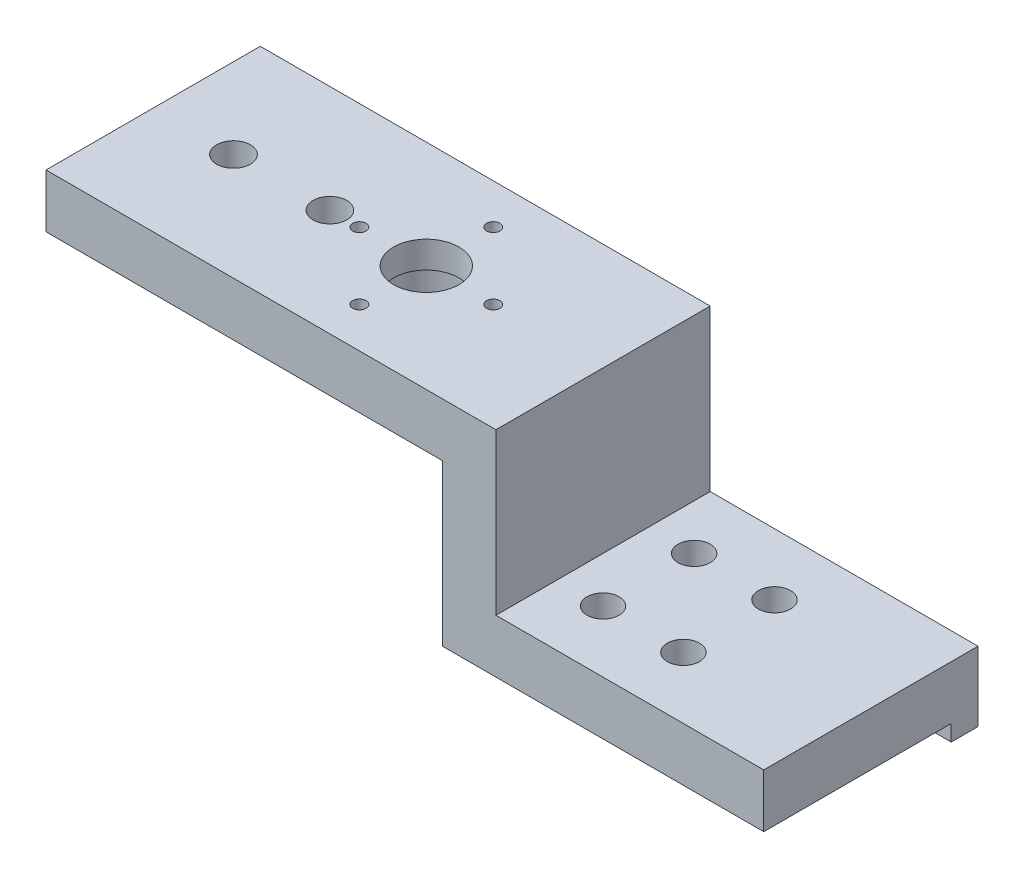
ISO-10303-21;
HEADER;
FILE_DESCRIPTION(('STEP AP214'),'2;1');
FILE_NAME('part.step','',(''),(''),'','','');
FILE_SCHEMA(('AUTOMOTIVE_DESIGN { 1 0 10303 214 1 1 1 1 }'));
ENDSEC;
DATA;
#1=APPLICATION_CONTEXT('core data for automotive mechanical design processes');
#2=APPLICATION_PROTOCOL_DEFINITION('international standard','automotive_design',2000,#1);
#3=PRODUCT_CONTEXT('',#1,'mechanical');
#4=PRODUCT('Part','Part','',(#3));
#5=PRODUCT_RELATED_PRODUCT_CATEGORY('part','',(#4));
#6=PRODUCT_DEFINITION_FORMATION('','',#4);
#7=PRODUCT_DEFINITION_CONTEXT('part definition',#1,'design');
#8=PRODUCT_DEFINITION('design','',#6,#7);
#9=PRODUCT_DEFINITION_SHAPE('','',#8);
#10=(LENGTH_UNIT() NAMED_UNIT(*) SI_UNIT(.MILLI.,.METRE.));
#11=(NAMED_UNIT(*) PLANE_ANGLE_UNIT() SI_UNIT($,.RADIAN.));
#12=(NAMED_UNIT(*) SI_UNIT($,.STERADIAN.) SOLID_ANGLE_UNIT());
#13=UNCERTAINTY_MEASURE_WITH_UNIT(LENGTH_MEASURE(1.E-05),#10,'distance_accuracy_value','');
#14=(GEOMETRIC_REPRESENTATION_CONTEXT(3) GLOBAL_UNCERTAINTY_ASSIGNED_CONTEXT((#13)) GLOBAL_UNIT_ASSIGNED_CONTEXT((#10,
#11,#12)) REPRESENTATION_CONTEXT('',''));
#15=CARTESIAN_POINT('',(0.,0.,0.));
#16=DIRECTION('',(0.,0.,1.));
#17=DIRECTION('',(1.,0.,0.));
#18=AXIS2_PLACEMENT_3D('',#15,#16,#17);
#19=CARTESIAN_POINT('',(-53.,104.,0.));
#20=DIRECTION('',(0.,-1.,0.));
#21=DIRECTION('',(0.,0.,-1.));
#22=AXIS2_PLACEMENT_3D('',#19,#20,#21);
#23=CYLINDRICAL_SURFACE('',#22,6.1);
#24=CARTESIAN_POINT('',(-53.,40.,0.));
#25=DIRECTION('',(0.,1.,0.));
#26=DIRECTION('',(0.,0.,1.));
#27=AXIS2_PLACEMENT_3D('',#24,#25,#26);
#28=CIRCLE('',#27,6.1);
#29=CARTESIAN_POINT('',(-53.,40.,6.1));
#30=VERTEX_POINT('',#29);
#31=EDGE_CURVE('E224',#30,#30,#28,.T.);
#32=ORIENTED_EDGE('',*,*,#31,.T.);
#33=EDGE_LOOP('',(#32));
#34=FACE_BOUND('',#33,.T.);
#35=CARTESIAN_POINT('',(-53.,35.,0.));
#36=DIRECTION('',(0.,-1.,0.));
#37=DIRECTION('',(0.,0.,-1.));
#38=AXIS2_PLACEMENT_3D('',#35,#36,#37);
#39=CIRCLE('',#38,6.1);
#40=CARTESIAN_POINT('',(-53.,35.,-6.1));
#41=VERTEX_POINT('',#40);
#42=EDGE_CURVE('E177',#41,#41,#39,.F.);
#43=ORIENTED_EDGE('',*,*,#42,.F.);
#44=EDGE_LOOP('',(#43));
#45=FACE_BOUND('',#44,.T.);
#46=ADVANCED_FACE('F42',(#34,#45),#23,.F.);
#47=CARTESIAN_POINT('',(-89.,104.,0.));
#48=DIRECTION('',(0.,-1.,0.));
#49=DIRECTION('',(0.,0.,-1.));
#50=AXIS2_PLACEMENT_3D('',#47,#48,#49);
#51=CYLINDRICAL_SURFACE('',#50,3.15);
#52=CARTESIAN_POINT('',(-89.,40.,0.));
#53=DIRECTION('',(0.,1.,0.));
#54=DIRECTION('',(0.,0.,1.));
#55=AXIS2_PLACEMENT_3D('',#52,#53,#54);
#56=CIRCLE('',#55,3.15);
#57=CARTESIAN_POINT('',(-89.,40.,3.15));
#58=VERTEX_POINT('',#57);
#59=EDGE_CURVE('E218',#58,#58,#56,.T.);
#60=ORIENTED_EDGE('',*,*,#59,.T.);
#61=EDGE_LOOP('',(#60));
#62=FACE_BOUND('',#61,.T.);
#63=CARTESIAN_POINT('',(-89.,33.,0.));
#64=DIRECTION('',(0.,-1.,0.));
#65=DIRECTION('',(0.,0.,-1.));
#66=AXIS2_PLACEMENT_3D('',#63,#64,#65);
#67=CIRCLE('',#66,3.15);
#68=CARTESIAN_POINT('',(-89.,33.,-3.15));
#69=VERTEX_POINT('',#68);
#70=EDGE_CURVE('E197',#69,#69,#67,.F.);
#71=ORIENTED_EDGE('',*,*,#70,.F.);
#72=EDGE_LOOP('',(#71));
#73=FACE_BOUND('',#72,.T.);
#74=ADVANCED_FACE('F282',(#62,#73),#51,.F.);
#75=CARTESIAN_POINT('',(-71.,104.,0.));
#76=DIRECTION('',(0.,-1.,0.));
#77=DIRECTION('',(0.,0.,-1.));
#78=AXIS2_PLACEMENT_3D('',#75,#76,#77);
#79=CYLINDRICAL_SURFACE('',#78,3.15);
#80=CARTESIAN_POINT('',(-71.,40.,0.));
#81=DIRECTION('',(0.,1.,0.));
#82=DIRECTION('',(0.,0.,1.));
#83=AXIS2_PLACEMENT_3D('',#80,#81,#82);
#84=CIRCLE('',#83,3.15);
#85=CARTESIAN_POINT('',(-71.,40.,3.15));
#86=VERTEX_POINT('',#85);
#87=EDGE_CURVE('E221',#86,#86,#84,.T.);
#88=ORIENTED_EDGE('',*,*,#87,.T.);
#89=EDGE_LOOP('',(#88));
#90=FACE_BOUND('',#89,.T.);
#91=CARTESIAN_POINT('',(-71.,33.,0.));
#92=DIRECTION('',(0.,-1.,0.));
#93=DIRECTION('',(0.,0.,-1.));
#94=AXIS2_PLACEMENT_3D('',#91,#92,#93);
#95=CIRCLE('',#94,3.15);
#96=CARTESIAN_POINT('',(-71.,33.,-3.15));
#97=VERTEX_POINT('',#96);
#98=EDGE_CURVE('E183',#97,#97,#95,.F.);
#99=ORIENTED_EDGE('',*,*,#98,.F.);
#100=EDGE_LOOP('',(#99));
#101=FACE_BOUND('',#100,.T.);
#102=ADVANCED_FACE('F288',(#90,#101),#79,.F.);
#103=CARTESIAN_POINT('',(0.,10.,0.));
#104=DIRECTION('',(0.,-1.,0.));
#105=DIRECTION('',(0.,0.,-1.));
#106=AXIS2_PLACEMENT_3D('',#103,#104,#105);
#107=PLANE('',#106);
#108=CARTESIAN_POINT('',(-11.5,9.99999999999999,-8.5));
#109=DIRECTION('',(0.,-1.,0.));
#110=DIRECTION('',(0.,0.,-1.));
#111=AXIS2_PLACEMENT_3D('',#108,#109,#110);
#112=CIRCLE('',#111,3.);
#113=CARTESIAN_POINT('',(-11.5,9.99999999999999,-11.5));
#114=VERTEX_POINT('',#113);
#115=EDGE_CURVE('E215',#114,#114,#112,.T.);
#116=ORIENTED_EDGE('',*,*,#115,.T.);
#117=EDGE_LOOP('',(#116));
#118=FACE_BOUND('',#117,.T.);
#119=CARTESIAN_POINT('',(3.50000000000002,9.99999999999999,8.5));
#120=DIRECTION('',(0.,-1.,0.));
#121=DIRECTION('',(0.,0.,-1.));
#122=AXIS2_PLACEMENT_3D('',#119,#120,#121);
#123=CIRCLE('',#122,3.);
#124=CARTESIAN_POINT('',(3.50000000000002,9.99999999999999,5.5));
#125=VERTEX_POINT('',#124);
#126=EDGE_CURVE('E212',#125,#125,#123,.T.);
#127=ORIENTED_EDGE('',*,*,#126,.T.);
#128=EDGE_LOOP('',(#127));
#129=FACE_BOUND('',#128,.T.);
#130=CARTESIAN_POINT('',(3.50000000000002,9.99999999999999,-8.5));
#131=DIRECTION('',(0.,-1.,0.));
#132=DIRECTION('',(0.,0.,-1.));
#133=AXIS2_PLACEMENT_3D('',#130,#131,#132);
#134=CIRCLE('',#133,3.);
#135=CARTESIAN_POINT('',(3.50000000000002,9.99999999999999,-11.5));
#136=VERTEX_POINT('',#135);
#137=EDGE_CURVE('E209',#136,#136,#134,.T.);
#138=ORIENTED_EDGE('',*,*,#137,.T.);
#139=EDGE_LOOP('',(#138));
#140=FACE_BOUND('',#139,.T.);
#141=CARTESIAN_POINT('',(-11.5,9.99999999999999,8.5));
#142=DIRECTION('',(0.,-1.,0.));
#143=DIRECTION('',(0.,0.,-1.));
#144=AXIS2_PLACEMENT_3D('',#141,#142,#143);
#145=CIRCLE('',#144,3.);
#146=CARTESIAN_POINT('',(-11.5,9.99999999999999,5.5));
#147=VERTEX_POINT('',#146);
#148=EDGE_CURVE('E206',#147,#147,#145,.T.);
#149=ORIENTED_EDGE('',*,*,#148,.T.);
#150=EDGE_LOOP('',(#149));
#151=FACE_BOUND('',#150,.T.);
#152=DIRECTION('',(0.,0.,-1.));
#153=VECTOR('',#152,1.);
#154=CARTESIAN_POINT('',(-20.,10.,20.));
#155=LINE('',#154,#153);
#156=CARTESIAN_POINT('',(-20.,10.,20.));
#157=VERTEX_POINT('',#156);
#158=CARTESIAN_POINT('',(-20.,10.,-20.));
#159=VERTEX_POINT('',#158);
#160=EDGE_CURVE('E243',#157,#159,#155,.T.);
#161=ORIENTED_EDGE('',*,*,#160,.F.);
#162=DIRECTION('',(1.,0.,0.));
#163=VECTOR('',#162,1.);
#164=CARTESIAN_POINT('',(-30.,10.,20.));
#165=LINE('',#164,#163);
#166=CARTESIAN_POINT('',(30.,10.,20.));
#167=VERTEX_POINT('',#166);
#168=EDGE_CURVE('E128',#157,#167,#165,.T.);
#169=ORIENTED_EDGE('',*,*,#168,.T.);
#170=DIRECTION('',(0.,0.,-1.));
#171=VECTOR('',#170,1.);
#172=CARTESIAN_POINT('',(30.,10.,20.));
#173=LINE('',#172,#171);
#174=CARTESIAN_POINT('',(30.,10.,-20.));
#175=VERTEX_POINT('',#174);
#176=EDGE_CURVE('E261',#167,#175,#173,.T.);
#177=ORIENTED_EDGE('',*,*,#176,.T.);
#178=DIRECTION('',(1.,0.,0.));
#179=VECTOR('',#178,1.);
#180=CARTESIAN_POINT('',(-30.,10.,-20.));
#181=LINE('',#180,#179);
#182=EDGE_CURVE('E259',#159,#175,#181,.T.);
#183=ORIENTED_EDGE('',*,*,#182,.F.);
#184=EDGE_LOOP('',(#161,#169,#177,#183));
#185=FACE_BOUND('',#184,.T.);
#186=ADVANCED_FACE('F296',(#118,#129,#140,#151,#185),#107,.F.);
#187=CARTESIAN_POINT('',(-30.,10.,20.));
#188=DIRECTION('',(-1.,0.,0.));
#189=DIRECTION('',(0.,0.,1.));
#190=AXIS2_PLACEMENT_3D('',#187,#188,#189);
#191=PLANE('',#190);
#192=DIRECTION('',(0.,0.,1.));
#193=VECTOR('',#192,1.);
#194=CARTESIAN_POINT('',(-30.,30.,-20.));
#195=LINE('',#194,#193);
#196=CARTESIAN_POINT('',(-30.,30.,-20.));
#197=VERTEX_POINT('',#196);
#198=CARTESIAN_POINT('',(-30.,30.,20.));
#199=VERTEX_POINT('',#198);
#200=EDGE_CURVE('E67',#197,#199,#195,.T.);
#201=ORIENTED_EDGE('',*,*,#200,.F.);
#202=DIRECTION('',(0.,-1.,0.));
#203=VECTOR('',#202,1.);
#204=CARTESIAN_POINT('',(-30.,10.,-20.));
#205=LINE('',#204,#203);
#206=CARTESIAN_POINT('',(-30.,-3.,-20.));
#207=VERTEX_POINT('',#206);
#208=EDGE_CURVE('E119',#197,#207,#205,.T.);
#209=ORIENTED_EDGE('',*,*,#208,.T.);
#210=DIRECTION('',(0.,0.,-1.));
#211=VECTOR('',#210,1.);
#212=CARTESIAN_POINT('',(-30.,-3.,-20.));
#213=LINE('',#212,#211);
#214=CARTESIAN_POINT('',(-30.,-3.,-15.));
#215=VERTEX_POINT('',#214);
#216=EDGE_CURVE('E123',#215,#207,#213,.T.);
#217=ORIENTED_EDGE('',*,*,#216,.F.);
#218=DIRECTION('',(0.,1.,0.));
#219=VECTOR('',#218,1.);
#220=CARTESIAN_POINT('',(-30.,-3.,-15.));
#221=LINE('',#220,#219);
#222=CARTESIAN_POINT('',(-30.,0.,-15.));
#223=VERTEX_POINT('',#222);
#224=EDGE_CURVE('E146',#215,#223,#221,.T.);
#225=ORIENTED_EDGE('',*,*,#224,.T.);
#226=DIRECTION('',(0.,0.,-1.));
#227=VECTOR('',#226,1.);
#228=CARTESIAN_POINT('',(-30.,0.,20.));
#229=LINE('',#228,#227);
#230=CARTESIAN_POINT('',(-30.,0.,20.));
#231=VERTEX_POINT('',#230);
#232=EDGE_CURVE('E258',#231,#223,#229,.T.);
#233=ORIENTED_EDGE('',*,*,#232,.F.);
#234=DIRECTION('',(0.,-1.,0.));
#235=VECTOR('',#234,1.);
#236=CARTESIAN_POINT('',(-30.,10.,20.));
#237=LINE('',#236,#235);
#238=EDGE_CURVE('E11',#199,#231,#237,.T.);
#239=ORIENTED_EDGE('',*,*,#238,.F.);
#240=EDGE_LOOP('',(#201,#209,#217,#225,#233,#239));
#241=FACE_BOUND('',#240,.T.);
#242=ADVANCED_FACE('F44',(#241),#191,.T.);
#243=CARTESIAN_POINT('',(-30.,10.,20.));
#244=DIRECTION('',(0.,0.,-1.));
#245=DIRECTION('',(-1.,0.,0.));
#246=AXIS2_PLACEMENT_3D('',#243,#244,#245);
#247=PLANE('',#246);
#248=DIRECTION('',(1.,0.,0.));
#249=VECTOR('',#248,1.);
#250=CARTESIAN_POINT('',(-30.,0.,20.));
#251=LINE('',#250,#249);
#252=CARTESIAN_POINT('',(30.,0.,20.));
#253=VERTEX_POINT('',#252);
#254=EDGE_CURVE('E262',#231,#253,#251,.T.);
#255=ORIENTED_EDGE('',*,*,#254,.T.);
#256=DIRECTION('',(0.,-1.,0.));
#257=VECTOR('',#256,1.);
#258=CARTESIAN_POINT('',(30.,10.,20.));
#259=LINE('',#258,#257);
#260=EDGE_CURVE('E51',#167,#253,#259,.T.);
#261=ORIENTED_EDGE('',*,*,#260,.F.);
#262=ORIENTED_EDGE('',*,*,#168,.F.);
#263=DIRECTION('',(0.,-1.,0.));
#264=VECTOR('',#263,1.);
#265=CARTESIAN_POINT('',(-20.,40.,20.));
#266=LINE('',#265,#264);
#267=CARTESIAN_POINT('',(-20.,40.,20.));
#268=VERTEX_POINT('',#267);
#269=EDGE_CURVE('E255',#268,#157,#266,.T.);
#270=ORIENTED_EDGE('',*,*,#269,.F.);
#271=DIRECTION('',(1.,0.,0.));
#272=VECTOR('',#271,1.);
#273=CARTESIAN_POINT('',(-20.,40.,20.));
#274=LINE('',#273,#272);
#275=CARTESIAN_POINT('',(-104.,40.,20.));
#276=VERTEX_POINT('',#275);
#277=EDGE_CURVE('E244',#276,#268,#274,.T.);
#278=ORIENTED_EDGE('',*,*,#277,.F.);
#279=DIRECTION('',(0.,1.,0.));
#280=VECTOR('',#279,1.);
#281=CARTESIAN_POINT('',(-104.,30.,20.));
#282=LINE('',#281,#280);
#283=CARTESIAN_POINT('',(-104.,30.,20.));
#284=VERTEX_POINT('',#283);
#285=EDGE_CURVE('E227',#284,#276,#282,.T.);
#286=ORIENTED_EDGE('',*,*,#285,.F.);
#287=DIRECTION('',(1.,0.,0.));
#288=VECTOR('',#287,1.);
#289=CARTESIAN_POINT('',(-104.,30.,20.));
#290=LINE('',#289,#288);
#291=EDGE_CURVE('E237',#284,#199,#290,.T.);
#292=ORIENTED_EDGE('',*,*,#291,.T.);
#293=ORIENTED_EDGE('',*,*,#238,.T.);
#294=EDGE_LOOP('',(#255,#261,#262,#270,#278,#286,#292,#293));
#295=FACE_BOUND('',#294,.T.);
#296=ADVANCED_FACE('F321',(#295),#247,.F.);
#297=CARTESIAN_POINT('',(30.,10.,20.));
#298=DIRECTION('',(-1.,0.,0.));
#299=DIRECTION('',(0.,0.,1.));
#300=AXIS2_PLACEMENT_3D('',#297,#298,#299);
#301=PLANE('',#300);
#302=DIRECTION('',(0.,0.,-1.));
#303=VECTOR('',#302,1.);
#304=CARTESIAN_POINT('',(30.,0.,20.));
#305=LINE('',#304,#303);
#306=CARTESIAN_POINT('',(30.,0.,-15.));
#307=VERTEX_POINT('',#306);
#308=EDGE_CURVE('E267',#253,#307,#305,.T.);
#309=ORIENTED_EDGE('',*,*,#308,.T.);
#310=DIRECTION('',(0.,1.,0.));
#311=VECTOR('',#310,1.);
#312=CARTESIAN_POINT('',(30.,-3.,-15.));
#313=LINE('',#312,#311);
#314=CARTESIAN_POINT('',(30.,-3.,-15.));
#315=VERTEX_POINT('',#314);
#316=EDGE_CURVE('E149',#315,#307,#313,.T.);
#317=ORIENTED_EDGE('',*,*,#316,.F.);
#318=DIRECTION('',(0.,0.,1.));
#319=VECTOR('',#318,1.);
#320=CARTESIAN_POINT('',(30.,-3.,-20.));
#321=LINE('',#320,#319);
#322=CARTESIAN_POINT('',(30.,-3.,-20.));
#323=VERTEX_POINT('',#322);
#324=EDGE_CURVE('E136',#323,#315,#321,.T.);
#325=ORIENTED_EDGE('',*,*,#324,.F.);
#326=DIRECTION('',(0.,-1.,0.));
#327=VECTOR('',#326,1.);
#328=CARTESIAN_POINT('',(30.,10.,-20.));
#329=LINE('',#328,#327);
#330=EDGE_CURVE('E127',#175,#323,#329,.T.);
#331=ORIENTED_EDGE('',*,*,#330,.F.);
#332=ORIENTED_EDGE('',*,*,#176,.F.);
#333=ORIENTED_EDGE('',*,*,#260,.T.);
#334=EDGE_LOOP('',(#309,#317,#325,#331,#332,#333));
#335=FACE_BOUND('',#334,.T.);
#336=ADVANCED_FACE('F324',(#335),#301,.F.);
#337=CARTESIAN_POINT('',(-30.,10.,-20.));
#338=DIRECTION('',(0.,0.,-1.));
#339=DIRECTION('',(-1.,0.,0.));
#340=AXIS2_PLACEMENT_3D('',#337,#338,#339);
#341=PLANE('',#340);
#342=ORIENTED_EDGE('',*,*,#330,.T.);
#343=DIRECTION('',(1.,0.,0.));
#344=VECTOR('',#343,1.);
#345=CARTESIAN_POINT('',(-30.,-3.,-20.));
#346=LINE('',#345,#344);
#347=EDGE_CURVE('E131',#207,#323,#346,.T.);
#348=ORIENTED_EDGE('',*,*,#347,.F.);
#349=ORIENTED_EDGE('',*,*,#208,.F.);
#350=DIRECTION('',(1.,0.,0.));
#351=VECTOR('',#350,1.);
#352=CARTESIAN_POINT('',(-104.,30.,-20.));
#353=LINE('',#352,#351);
#354=CARTESIAN_POINT('',(-104.,30.,-20.));
#355=VERTEX_POINT('',#354);
#356=EDGE_CURVE('E241',#355,#197,#353,.T.);
#357=ORIENTED_EDGE('',*,*,#356,.F.);
#358=DIRECTION('',(0.,-1.,0.));
#359=VECTOR('',#358,1.);
#360=CARTESIAN_POINT('',(-104.,30.,-20.));
#361=LINE('',#360,#359);
#362=CARTESIAN_POINT('',(-104.,40.,-20.));
#363=VERTEX_POINT('',#362);
#364=EDGE_CURVE('E233',#363,#355,#361,.T.);
#365=ORIENTED_EDGE('',*,*,#364,.F.);
#366=DIRECTION('',(-1.,0.,0.));
#367=VECTOR('',#366,1.);
#368=CARTESIAN_POINT('',(-20.,40.,-20.));
#369=LINE('',#368,#367);
#370=CARTESIAN_POINT('',(-20.,40.,-20.));
#371=VERTEX_POINT('',#370);
#372=EDGE_CURVE('E248',#371,#363,#369,.T.);
#373=ORIENTED_EDGE('',*,*,#372,.F.);
#374=DIRECTION('',(0.,-1.,0.));
#375=VECTOR('',#374,1.);
#376=CARTESIAN_POINT('',(-20.,40.,-20.));
#377=LINE('',#376,#375);
#378=EDGE_CURVE('E250',#371,#159,#377,.T.);
#379=ORIENTED_EDGE('',*,*,#378,.T.);
#380=ORIENTED_EDGE('',*,*,#182,.T.);
#381=EDGE_LOOP('',(#342,#348,#349,#357,#365,#373,#379,#380));
#382=FACE_BOUND('',#381,.T.);
#383=ADVANCED_FACE('F132',(#382),#341,.T.);
#384=CARTESIAN_POINT('',(0.,0.,0.));
#385=DIRECTION('',(0.,-1.,0.));
#386=DIRECTION('',(0.,0.,-1.));
#387=AXIS2_PLACEMENT_3D('',#384,#385,#386);
#388=PLANE('',#387);
#389=DIRECTION('',(-1.,0.,0.));
#390=VECTOR('',#389,1.);
#391=CARTESIAN_POINT('',(-30.,0.,-15.));
#392=LINE('',#391,#390);
#393=EDGE_CURVE('E59',#307,#223,#392,.T.);
#394=ORIENTED_EDGE('',*,*,#393,.F.);
#395=ORIENTED_EDGE('',*,*,#308,.F.);
#396=ORIENTED_EDGE('',*,*,#254,.F.);
#397=ORIENTED_EDGE('',*,*,#232,.T.);
#398=EDGE_LOOP('',(#394,#395,#396,#397));
#399=FACE_BOUND('',#398,.T.);
#400=CARTESIAN_POINT('',(-11.5,0.,-8.5));
#401=DIRECTION('',(0.,-1.,0.));
#402=DIRECTION('',(0.,0.,1.));
#403=AXIS2_PLACEMENT_3D('',#400,#401,#402);
#404=CIRCLE('',#403,3.);
#405=CARTESIAN_POINT('',(-11.5,0.,-5.5));
#406=VERTEX_POINT('',#405);
#407=EDGE_CURVE('E198',#406,#406,#404,.T.);
#408=ORIENTED_EDGE('',*,*,#407,.F.);
#409=EDGE_LOOP('',(#408));
#410=FACE_BOUND('',#409,.T.);
#411=CARTESIAN_POINT('',(3.50000000000002,0.,8.5));
#412=DIRECTION('',(0.,-1.,0.));
#413=DIRECTION('',(0.,0.,-1.));
#414=AXIS2_PLACEMENT_3D('',#411,#412,#413);
#415=CIRCLE('',#414,3.);
#416=CARTESIAN_POINT('',(3.50000000000002,0.,5.5));
#417=VERTEX_POINT('',#416);
#418=EDGE_CURVE('E196',#417,#417,#415,.T.);
#419=ORIENTED_EDGE('',*,*,#418,.F.);
#420=EDGE_LOOP('',(#419));
#421=FACE_BOUND('',#420,.T.);
#422=CARTESIAN_POINT('',(3.50000000000002,0.,-8.5));
#423=DIRECTION('',(0.,-1.,0.));
#424=DIRECTION('',(0.,0.,-1.));
#425=AXIS2_PLACEMENT_3D('',#422,#423,#424);
#426=CIRCLE('',#425,3.);
#427=CARTESIAN_POINT('',(3.50000000000002,0.,-11.5));
#428=VERTEX_POINT('',#427);
#429=EDGE_CURVE('E193',#428,#428,#426,.T.);
#430=ORIENTED_EDGE('',*,*,#429,.F.);
#431=EDGE_LOOP('',(#430));
#432=FACE_BOUND('',#431,.T.);
#433=CARTESIAN_POINT('',(-11.5,0.,8.5));
#434=DIRECTION('',(0.,-1.,0.));
#435=DIRECTION('',(0.,0.,-1.));
#436=AXIS2_PLACEMENT_3D('',#433,#434,#435);
#437=CIRCLE('',#436,3.);
#438=CARTESIAN_POINT('',(-11.5,0.,5.5));
#439=VERTEX_POINT('',#438);
#440=EDGE_CURVE('E201',#439,#439,#437,.T.);
#441=ORIENTED_EDGE('',*,*,#440,.F.);
#442=EDGE_LOOP('',(#441));
#443=FACE_BOUND('',#442,.T.);
#444=ADVANCED_FACE('F314',(#399,#410,#421,#432,#443),#388,.T.);
#445=CARTESIAN_POINT('',(-20.,40.,20.));
#446=DIRECTION('',(-1.,0.,0.));
#447=DIRECTION('',(0.,0.,1.));
#448=AXIS2_PLACEMENT_3D('',#445,#446,#447);
#449=PLANE('',#448);
#450=ORIENTED_EDGE('',*,*,#160,.T.);
#451=ORIENTED_EDGE('',*,*,#378,.F.);
#452=DIRECTION('',(0.,0.,-1.));
#453=VECTOR('',#452,1.);
#454=CARTESIAN_POINT('',(-20.,40.,20.));
#455=LINE('',#454,#453);
#456=EDGE_CURVE('E246',#268,#371,#455,.T.);
#457=ORIENTED_EDGE('',*,*,#456,.F.);
#458=ORIENTED_EDGE('',*,*,#269,.T.);
#459=EDGE_LOOP('',(#450,#451,#457,#458));
#460=FACE_BOUND('',#459,.T.);
#461=ADVANCED_FACE('F310',(#460),#449,.F.);
#462=CARTESIAN_POINT('',(0.,40.,0.));
#463=DIRECTION('',(0.,1.,0.));
#464=DIRECTION('',(0.,0.,1.));
#465=AXIS2_PLACEMENT_3D('',#462,#463,#464);
#466=PLANE('',#465);
#467=CARTESIAN_POINT('',(-40.5,40.,-1.31838984174237E-13));
#468=DIRECTION('',(0.,1.,0.));
#469=DIRECTION('',(0.,0.,1.));
#470=AXIS2_PLACEMENT_3D('',#467,#468,#469);
#471=CIRCLE('',#470,1.24999999999999);
#472=CARTESIAN_POINT('',(-40.5,40.,1.24999999999986));
#473=VERTEX_POINT('',#472);
#474=EDGE_CURVE('E152',#473,#473,#471,.T.);
#475=ORIENTED_EDGE('',*,*,#474,.F.);
#476=EDGE_LOOP('',(#475));
#477=FACE_BOUND('',#476,.T.);
#478=CARTESIAN_POINT('',(-53.,40.,12.5));
#479=DIRECTION('',(0.,1.,0.));
#480=DIRECTION('',(0.,0.,1.));
#481=AXIS2_PLACEMENT_3D('',#478,#479,#480);
#482=CIRCLE('',#481,1.24999999999999);
#483=CARTESIAN_POINT('',(-53.,40.,13.75));
#484=VERTEX_POINT('',#483);
#485=EDGE_CURVE('E158',#484,#484,#482,.T.);
#486=ORIENTED_EDGE('',*,*,#485,.F.);
#487=EDGE_LOOP('',(#486));
#488=FACE_BOUND('',#487,.T.);
#489=CARTESIAN_POINT('',(-65.5,40.,0.));
#490=DIRECTION('',(0.,1.,0.));
#491=DIRECTION('',(0.,0.,1.));
#492=AXIS2_PLACEMENT_3D('',#489,#490,#491);
#493=CIRCLE('',#492,1.25);
#494=CARTESIAN_POINT('',(-65.5,40.,1.25000000000004));
#495=VERTEX_POINT('',#494);
#496=EDGE_CURVE('E164',#495,#495,#493,.T.);
#497=ORIENTED_EDGE('',*,*,#496,.F.);
#498=EDGE_LOOP('',(#497));
#499=FACE_BOUND('',#498,.T.);
#500=CARTESIAN_POINT('',(-53.,40.,-12.5));
#501=DIRECTION('',(0.,1.,0.));
#502=DIRECTION('',(0.,0.,1.));
#503=AXIS2_PLACEMENT_3D('',#500,#501,#502);
#504=CIRCLE('',#503,1.24999999999999);
#505=CARTESIAN_POINT('',(-53.,40.,-11.25));
#506=VERTEX_POINT('',#505);
#507=EDGE_CURVE('E167',#506,#506,#504,.T.);
#508=ORIENTED_EDGE('',*,*,#507,.F.);
#509=EDGE_LOOP('',(#508));
#510=FACE_BOUND('',#509,.T.);
#511=ORIENTED_EDGE('',*,*,#31,.F.);
#512=EDGE_LOOP('',(#511));
#513=FACE_BOUND('',#512,.T.);
#514=ORIENTED_EDGE('',*,*,#87,.F.);
#515=EDGE_LOOP('',(#514));
#516=FACE_BOUND('',#515,.T.);
#517=ORIENTED_EDGE('',*,*,#59,.F.);
#518=EDGE_LOOP('',(#517));
#519=FACE_BOUND('',#518,.T.);
#520=ORIENTED_EDGE('',*,*,#372,.T.);
#521=DIRECTION('',(0.,0.,-1.));
#522=VECTOR('',#521,1.);
#523=CARTESIAN_POINT('',(-104.,40.,-20.));
#524=LINE('',#523,#522);
#525=EDGE_CURVE('E230',#276,#363,#524,.T.);
#526=ORIENTED_EDGE('',*,*,#525,.F.);
#527=ORIENTED_EDGE('',*,*,#277,.T.);
#528=ORIENTED_EDGE('',*,*,#456,.T.);
#529=EDGE_LOOP('',(#520,#526,#527,#528));
#530=FACE_BOUND('',#529,.T.);
#531=ADVANCED_FACE('F306',(#477,#488,#499,#510,#513,#516,#519,#530),#466,.T.);
#532=CARTESIAN_POINT('',(-104.,30.,-20.));
#533=DIRECTION('',(0.,1.,0.));
#534=DIRECTION('',(0.,0.,1.));
#535=AXIS2_PLACEMENT_3D('',#532,#533,#534);
#536=PLANE('',#535);
#537=CARTESIAN_POINT('',(-40.5,30.,-1.31838984174237E-13));
#538=DIRECTION('',(0.,1.,0.));
#539=DIRECTION('',(0.,0.,1.));
#540=AXIS2_PLACEMENT_3D('',#537,#538,#539);
#541=CIRCLE('',#540,1.24999999999999);
#542=CARTESIAN_POINT('',(-40.5,30.,1.24999999999986));
#543=VERTEX_POINT('',#542);
#544=EDGE_CURVE('E155',#543,#543,#541,.T.);
#545=ORIENTED_EDGE('',*,*,#544,.T.);
#546=EDGE_LOOP('',(#545));
#547=FACE_BOUND('',#546,.T.);
#548=CARTESIAN_POINT('',(-53.,30.,12.5));
#549=DIRECTION('',(0.,1.,0.));
#550=DIRECTION('',(0.,0.,1.));
#551=AXIS2_PLACEMENT_3D('',#548,#549,#550);
#552=CIRCLE('',#551,1.24999999999999);
#553=CARTESIAN_POINT('',(-53.,30.,13.75));
#554=VERTEX_POINT('',#553);
#555=EDGE_CURVE('E161',#554,#554,#552,.T.);
#556=ORIENTED_EDGE('',*,*,#555,.T.);
#557=EDGE_LOOP('',(#556));
#558=FACE_BOUND('',#557,.T.);
#559=CARTESIAN_POINT('',(-65.5,30.,0.));
#560=DIRECTION('',(0.,1.,0.));
#561=DIRECTION('',(0.,0.,1.));
#562=AXIS2_PLACEMENT_3D('',#559,#560,#561);
#563=CIRCLE('',#562,1.24999999999999);
#564=CARTESIAN_POINT('',(-65.5,30.,1.25000000000004));
#565=VERTEX_POINT('',#564);
#566=EDGE_CURVE('E46',#565,#565,#563,.T.);
#567=ORIENTED_EDGE('',*,*,#566,.T.);
#568=EDGE_LOOP('',(#567));
#569=FACE_BOUND('',#568,.T.);
#570=CARTESIAN_POINT('',(-53.,30.,-12.5));
#571=DIRECTION('',(0.,1.,0.));
#572=DIRECTION('',(0.,0.,1.));
#573=AXIS2_PLACEMENT_3D('',#570,#571,#572);
#574=CIRCLE('',#573,1.24999999999999);
#575=CARTESIAN_POINT('',(-53.,30.,-11.25));
#576=VERTEX_POINT('',#575);
#577=EDGE_CURVE('E170',#576,#576,#574,.T.);
#578=ORIENTED_EDGE('',*,*,#577,.T.);
#579=EDGE_LOOP('',(#578));
#580=FACE_BOUND('',#579,.T.);
#581=CARTESIAN_POINT('',(-53.,30.,0.));
#582=DIRECTION('',(0.,-1.,0.));
#583=DIRECTION('',(0.,0.,-1.));
#584=AXIS2_PLACEMENT_3D('',#581,#582,#583);
#585=CIRCLE('',#584,6.5);
#586=CARTESIAN_POINT('',(-53.,30.,-6.5));
#587=VERTEX_POINT('',#586);
#588=EDGE_CURVE('E173',#587,#587,#585,.T.);
#589=ORIENTED_EDGE('',*,*,#588,.F.);
#590=EDGE_LOOP('',(#589));
#591=FACE_BOUND('',#590,.T.);
#592=CARTESIAN_POINT('',(-89.,30.,0.));
#593=DIRECTION('',(0.,-1.,0.));
#594=DIRECTION('',(0.,0.,-1.));
#595=AXIS2_PLACEMENT_3D('',#592,#593,#594);
#596=CIRCLE('',#595,3.50000000000001);
#597=CARTESIAN_POINT('',(-89.,30.,-3.50000000000001));
#598=VERTEX_POINT('',#597);
#599=EDGE_CURVE('E184',#598,#598,#596,.T.);
#600=ORIENTED_EDGE('',*,*,#599,.F.);
#601=EDGE_LOOP('',(#600));
#602=FACE_BOUND('',#601,.T.);
#603=CARTESIAN_POINT('',(-71.,30.,0.));
#604=DIRECTION('',(0.,-1.,0.));
#605=DIRECTION('',(0.,0.,-1.));
#606=AXIS2_PLACEMENT_3D('',#603,#604,#605);
#607=CIRCLE('',#606,3.50000000000001);
#608=CARTESIAN_POINT('',(-71.,30.,-3.50000000000001));
#609=VERTEX_POINT('',#608);
#610=EDGE_CURVE('E190',#609,#609,#607,.T.);
#611=ORIENTED_EDGE('',*,*,#610,.F.);
#612=EDGE_LOOP('',(#611));
#613=FACE_BOUND('',#612,.T.);
#614=ORIENTED_EDGE('',*,*,#200,.T.);
#615=ORIENTED_EDGE('',*,*,#291,.F.);
#616=DIRECTION('',(0.,0.,1.));
#617=VECTOR('',#616,1.);
#618=CARTESIAN_POINT('',(-104.,30.,-20.));
#619=LINE('',#618,#617);
#620=EDGE_CURVE('E235',#355,#284,#619,.T.);
#621=ORIENTED_EDGE('',*,*,#620,.F.);
#622=ORIENTED_EDGE('',*,*,#356,.T.);
#623=EDGE_LOOP('',(#614,#615,#621,#622));
#624=FACE_BOUND('',#623,.T.);
#625=ADVANCED_FACE('F302',(#547,#558,#569,#580,#591,#602,#613,#624),#536,.F.);
#626=CARTESIAN_POINT('',(-104.,0.,0.));
#627=DIRECTION('',(1.,0.,0.));
#628=DIRECTION('',(0.,0.,-1.));
#629=AXIS2_PLACEMENT_3D('',#626,#627,#628);
#630=PLANE('',#629);
#631=ORIENTED_EDGE('',*,*,#285,.T.);
#632=ORIENTED_EDGE('',*,*,#525,.T.);
#633=ORIENTED_EDGE('',*,*,#364,.T.);
#634=ORIENTED_EDGE('',*,*,#620,.T.);
#635=EDGE_LOOP('',(#631,#632,#633,#634));
#636=FACE_BOUND('',#635,.T.);
#637=ADVANCED_FACE('F299',(#636),#630,.F.);
#638=CARTESIAN_POINT('',(-11.5,74.,8.5));
#639=DIRECTION('',(0.,-1.,0.));
#640=DIRECTION('',(0.,0.,-1.));
#641=AXIS2_PLACEMENT_3D('',#638,#639,#640);
#642=CYLINDRICAL_SURFACE('',#641,3.);
#643=ORIENTED_EDGE('',*,*,#440,.T.);
#644=EDGE_LOOP('',(#643));
#645=FACE_BOUND('',#644,.T.);
#646=ORIENTED_EDGE('',*,*,#148,.F.);
#647=EDGE_LOOP('',(#646));
#648=FACE_BOUND('',#647,.T.);
#649=ADVANCED_FACE('F293',(#645,#648),#642,.F.);
#650=CARTESIAN_POINT('',(3.50000000000002,74.,-8.5));
#651=DIRECTION('',(0.,-1.,0.));
#652=DIRECTION('',(0.,0.,-1.));
#653=AXIS2_PLACEMENT_3D('',#650,#651,#652);
#654=CYLINDRICAL_SURFACE('',#653,3.);
#655=ORIENTED_EDGE('',*,*,#429,.T.);
#656=EDGE_LOOP('',(#655));
#657=FACE_BOUND('',#656,.T.);
#658=ORIENTED_EDGE('',*,*,#137,.F.);
#659=EDGE_LOOP('',(#658));
#660=FACE_BOUND('',#659,.T.);
#661=ADVANCED_FACE('F364',(#657,#660),#654,.F.);
#662=CARTESIAN_POINT('',(3.50000000000002,74.,8.5));
#663=DIRECTION('',(0.,-1.,0.));
#664=DIRECTION('',(0.,0.,-1.));
#665=AXIS2_PLACEMENT_3D('',#662,#663,#664);
#666=CYLINDRICAL_SURFACE('',#665,3.);
#667=ORIENTED_EDGE('',*,*,#418,.T.);
#668=EDGE_LOOP('',(#667));
#669=FACE_BOUND('',#668,.T.);
#670=ORIENTED_EDGE('',*,*,#126,.F.);
#671=EDGE_LOOP('',(#670));
#672=FACE_BOUND('',#671,.T.);
#673=ADVANCED_FACE('F371',(#669,#672),#666,.F.);
#674=CARTESIAN_POINT('',(-11.5,74.,-8.5));
#675=DIRECTION('',(0.,-1.,0.));
#676=DIRECTION('',(0.,0.,-1.));
#677=AXIS2_PLACEMENT_3D('',#674,#675,#676);
#678=CYLINDRICAL_SURFACE('',#677,3.);
#679=ORIENTED_EDGE('',*,*,#407,.T.);
#680=EDGE_LOOP('',(#679));
#681=FACE_BOUND('',#680,.T.);
#682=ORIENTED_EDGE('',*,*,#115,.F.);
#683=EDGE_LOOP('',(#682));
#684=FACE_BOUND('',#683,.T.);
#685=ADVANCED_FACE('F379',(#681,#684),#678,.F.);
#686=CARTESIAN_POINT('',(-71.,33.,0.));
#687=DIRECTION('',(0.,-1.,0.));
#688=DIRECTION('',(0.,0.,-1.));
#689=AXIS2_PLACEMENT_3D('',#686,#687,#688);
#690=PLANE('',#689);
#691=CARTESIAN_POINT('',(-71.,33.,0.));
#692=DIRECTION('',(0.,-1.,0.));
#693=DIRECTION('',(0.,0.,-1.));
#694=AXIS2_PLACEMENT_3D('',#691,#692,#693);
#695=CIRCLE('',#694,3.50000000000001);
#696=CARTESIAN_POINT('',(-71.,33.,-3.50000000000001));
#697=VERTEX_POINT('',#696);
#698=EDGE_CURVE('E187',#697,#697,#695,.T.);
#699=ORIENTED_EDGE('',*,*,#698,.T.);
#700=EDGE_LOOP('',(#699));
#701=FACE_BOUND('',#700,.T.);
#702=ORIENTED_EDGE('',*,*,#98,.T.);
#703=EDGE_LOOP('',(#702));
#704=FACE_BOUND('',#703,.T.);
#705=ADVANCED_FACE('F386',(#701,#704),#690,.T.);
#706=CARTESIAN_POINT('',(-71.,33.,0.));
#707=DIRECTION('',(0.,-1.,0.));
#708=DIRECTION('',(0.,0.,-1.));
#709=AXIS2_PLACEMENT_3D('',#706,#707,#708);
#710=CYLINDRICAL_SURFACE('',#709,3.50000000000001);
#711=ORIENTED_EDGE('',*,*,#698,.F.);
#712=EDGE_LOOP('',(#711));
#713=FACE_BOUND('',#712,.T.);
#714=ORIENTED_EDGE('',*,*,#610,.T.);
#715=EDGE_LOOP('',(#714));
#716=FACE_BOUND('',#715,.T.);
#717=ADVANCED_FACE('F395',(#713,#716),#710,.F.);
#718=CARTESIAN_POINT('',(-89.,33.,0.));
#719=DIRECTION('',(0.,-1.,0.));
#720=DIRECTION('',(0.,0.,-1.));
#721=AXIS2_PLACEMENT_3D('',#718,#719,#720);
#722=PLANE('',#721);
#723=CARTESIAN_POINT('',(-89.,33.,0.));
#724=DIRECTION('',(0.,-1.,0.));
#725=DIRECTION('',(0.,0.,-1.));
#726=AXIS2_PLACEMENT_3D('',#723,#724,#725);
#727=CIRCLE('',#726,3.50000000000001);
#728=CARTESIAN_POINT('',(-89.,33.,-3.50000000000001));
#729=VERTEX_POINT('',#728);
#730=EDGE_CURVE('E180',#729,#729,#727,.T.);
#731=ORIENTED_EDGE('',*,*,#730,.T.);
#732=EDGE_LOOP('',(#731));
#733=FACE_BOUND('',#732,.T.);
#734=ORIENTED_EDGE('',*,*,#70,.T.);
#735=EDGE_LOOP('',(#734));
#736=FACE_BOUND('',#735,.T.);
#737=ADVANCED_FACE('F404',(#733,#736),#722,.T.);
#738=CARTESIAN_POINT('',(-89.,33.,0.));
#739=DIRECTION('',(0.,-1.,0.));
#740=DIRECTION('',(0.,0.,-1.));
#741=AXIS2_PLACEMENT_3D('',#738,#739,#740);
#742=CYLINDRICAL_SURFACE('',#741,3.50000000000001);
#743=ORIENTED_EDGE('',*,*,#730,.F.);
#744=EDGE_LOOP('',(#743));
#745=FACE_BOUND('',#744,.T.);
#746=ORIENTED_EDGE('',*,*,#599,.T.);
#747=EDGE_LOOP('',(#746));
#748=FACE_BOUND('',#747,.T.);
#749=ADVANCED_FACE('F412',(#745,#748),#742,.F.);
#750=CARTESIAN_POINT('',(-53.,35.,0.));
#751=DIRECTION('',(0.,-1.,0.));
#752=DIRECTION('',(0.,0.,-1.));
#753=AXIS2_PLACEMENT_3D('',#750,#751,#752);
#754=PLANE('',#753);
#755=CARTESIAN_POINT('',(-53.,35.,0.));
#756=DIRECTION('',(0.,-1.,0.));
#757=DIRECTION('',(0.,0.,-1.));
#758=AXIS2_PLACEMENT_3D('',#755,#756,#757);
#759=CIRCLE('',#758,6.5);
#760=CARTESIAN_POINT('',(-53.,35.,-6.5));
#761=VERTEX_POINT('',#760);
#762=EDGE_CURVE('E174',#761,#761,#759,.T.);
#763=ORIENTED_EDGE('',*,*,#762,.T.);
#764=EDGE_LOOP('',(#763));
#765=FACE_BOUND('',#764,.T.);
#766=ORIENTED_EDGE('',*,*,#42,.T.);
#767=EDGE_LOOP('',(#766));
#768=FACE_BOUND('',#767,.T.);
#769=ADVANCED_FACE('F279',(#765,#768),#754,.T.);
#770=CARTESIAN_POINT('',(-53.,35.,0.));
#771=DIRECTION('',(0.,-1.,0.));
#772=DIRECTION('',(0.,0.,-1.));
#773=AXIS2_PLACEMENT_3D('',#770,#771,#772);
#774=CYLINDRICAL_SURFACE('',#773,6.5);
#775=ORIENTED_EDGE('',*,*,#762,.F.);
#776=EDGE_LOOP('',(#775));
#777=FACE_BOUND('',#776,.T.);
#778=ORIENTED_EDGE('',*,*,#588,.T.);
#779=EDGE_LOOP('',(#778));
#780=FACE_BOUND('',#779,.T.);
#781=ADVANCED_FACE('F427',(#777,#780),#774,.F.);
#782=CARTESIAN_POINT('',(-53.,40.,-12.5));
#783=DIRECTION('',(0.,1.,0.));
#784=DIRECTION('',(0.,0.,1.));
#785=AXIS2_PLACEMENT_3D('',#782,#783,#784);
#786=CYLINDRICAL_SURFACE('',#785,1.24999999999999);
#787=ORIENTED_EDGE('',*,*,#507,.T.);
#788=EDGE_LOOP('',(#787));
#789=FACE_BOUND('',#788,.T.);
#790=ORIENTED_EDGE('',*,*,#577,.F.);
#791=EDGE_LOOP('',(#790));
#792=FACE_BOUND('',#791,.T.);
#793=ADVANCED_FACE('F435',(#789,#792),#786,.F.);
#794=CARTESIAN_POINT('',(-65.5,40.,0.));
#795=DIRECTION('',(0.,1.,0.));
#796=DIRECTION('',(0.,0.,1.));
#797=AXIS2_PLACEMENT_3D('',#794,#795,#796);
#798=CYLINDRICAL_SURFACE('',#797,1.24999999999999);
#799=ORIENTED_EDGE('',*,*,#496,.T.);
#800=EDGE_LOOP('',(#799));
#801=FACE_BOUND('',#800,.T.);
#802=ORIENTED_EDGE('',*,*,#566,.F.);
#803=EDGE_LOOP('',(#802));
#804=FACE_BOUND('',#803,.T.);
#805=ADVANCED_FACE('F443',(#801,#804),#798,.F.);
#806=CARTESIAN_POINT('',(-53.,40.,12.5));
#807=DIRECTION('',(0.,1.,0.));
#808=DIRECTION('',(0.,0.,1.));
#809=AXIS2_PLACEMENT_3D('',#806,#807,#808);
#810=CYLINDRICAL_SURFACE('',#809,1.24999999999999);
#811=ORIENTED_EDGE('',*,*,#485,.T.);
#812=EDGE_LOOP('',(#811));
#813=FACE_BOUND('',#812,.T.);
#814=ORIENTED_EDGE('',*,*,#555,.F.);
#815=EDGE_LOOP('',(#814));
#816=FACE_BOUND('',#815,.T.);
#817=ADVANCED_FACE('F452',(#813,#816),#810,.F.);
#818=CARTESIAN_POINT('',(-40.5,40.,-1.31838984174237E-13));
#819=DIRECTION('',(0.,1.,0.));
#820=DIRECTION('',(0.,0.,1.));
#821=AXIS2_PLACEMENT_3D('',#818,#819,#820);
#822=CYLINDRICAL_SURFACE('',#821,1.24999999999999);
#823=ORIENTED_EDGE('',*,*,#474,.T.);
#824=EDGE_LOOP('',(#823));
#825=FACE_BOUND('',#824,.T.);
#826=ORIENTED_EDGE('',*,*,#544,.F.);
#827=EDGE_LOOP('',(#826));
#828=FACE_BOUND('',#827,.T.);
#829=ADVANCED_FACE('F462',(#825,#828),#822,.F.);
#830=CARTESIAN_POINT('',(-30.,-3.,-15.));
#831=DIRECTION('',(0.,0.,-1.));
#832=DIRECTION('',(-1.,0.,0.));
#833=AXIS2_PLACEMENT_3D('',#830,#831,#832);
#834=PLANE('',#833);
#835=ORIENTED_EDGE('',*,*,#393,.T.);
#836=ORIENTED_EDGE('',*,*,#224,.F.);
#837=DIRECTION('',(-1.,0.,0.));
#838=VECTOR('',#837,1.);
#839=CARTESIAN_POINT('',(-30.,-3.,-15.));
#840=LINE('',#839,#838);
#841=EDGE_CURVE('E140',#315,#215,#840,.T.);
#842=ORIENTED_EDGE('',*,*,#841,.F.);
#843=ORIENTED_EDGE('',*,*,#316,.T.);
#844=EDGE_LOOP('',(#835,#836,#842,#843));
#845=FACE_BOUND('',#844,.T.);
#846=ADVANCED_FACE('F469',(#845),#834,.F.);
#847=CARTESIAN_POINT('',(0.,-3.,0.));
#848=DIRECTION('',(0.,1.,0.));
#849=DIRECTION('',(0.,0.,1.));
#850=AXIS2_PLACEMENT_3D('',#847,#848,#849);
#851=PLANE('',#850);
#852=ORIENTED_EDGE('',*,*,#216,.T.);
#853=ORIENTED_EDGE('',*,*,#347,.T.);
#854=ORIENTED_EDGE('',*,*,#324,.T.);
#855=ORIENTED_EDGE('',*,*,#841,.T.);
#856=EDGE_LOOP('',(#852,#853,#854,#855));
#857=FACE_BOUND('',#856,.T.);
#858=ADVANCED_FACE('F138',(#857),#851,.F.);
#859=CLOSED_SHELL('',(#46,#74,#102,#186,#242,#296,#336,#383,#444,#461,#531,#625,#637,#649,#661,
#673,#685,#705,#717,#737,#749,#769,#781,#793,#805,#817,#829,#846,#858));
#860=MANIFOLD_SOLID_BREP('B2',#859);
#861=ADVANCED_BREP_SHAPE_REPRESENTATION('',(#18,#860),#14);
#862=SHAPE_DEFINITION_REPRESENTATION(#9,#861);
ENDSEC;
END-ISO-10303-21;
